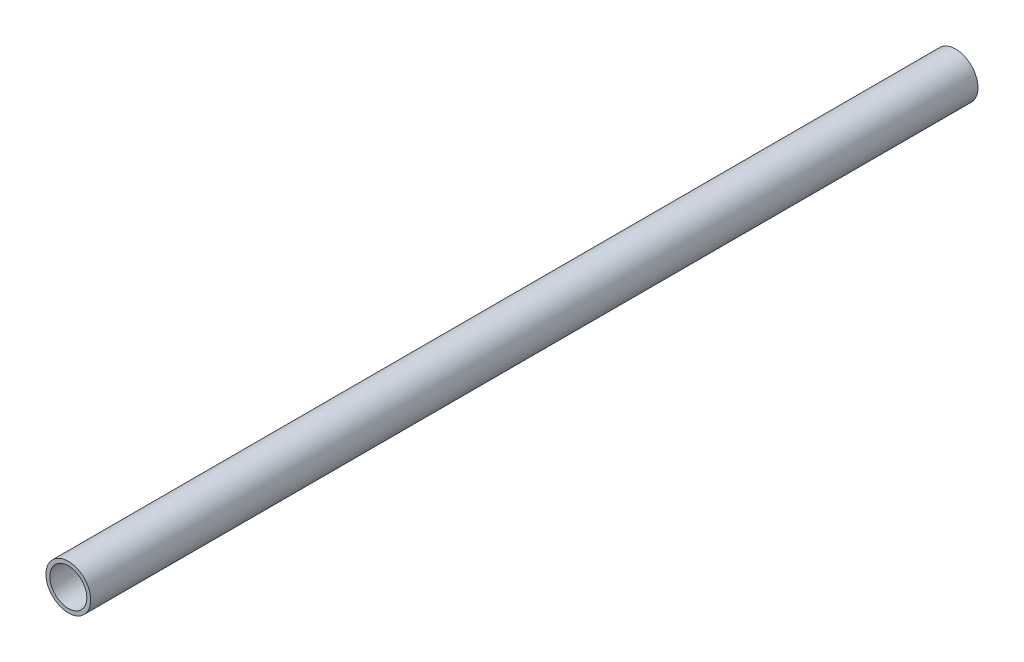
ISO-10303-21;
HEADER;
FILE_DESCRIPTION(('STEP AP214'),'2;1');
FILE_NAME('part.step','',(''),(''),'','','');
FILE_SCHEMA(('AUTOMOTIVE_DESIGN { 1 0 10303 214 1 1 1 1 }'));
ENDSEC;
DATA;
#1=APPLICATION_CONTEXT('core data for automotive mechanical design processes');
#2=APPLICATION_PROTOCOL_DEFINITION('international standard','automotive_design',2000,#1);
#3=PRODUCT_CONTEXT('',#1,'mechanical');
#4=PRODUCT('Part','Part','',(#3));
#5=PRODUCT_RELATED_PRODUCT_CATEGORY('part','',(#4));
#6=PRODUCT_DEFINITION_FORMATION('','',#4);
#7=PRODUCT_DEFINITION_CONTEXT('part definition',#1,'design');
#8=PRODUCT_DEFINITION('design','',#6,#7);
#9=PRODUCT_DEFINITION_SHAPE('','',#8);
#10=(LENGTH_UNIT() NAMED_UNIT(*) SI_UNIT(.MILLI.,.METRE.));
#11=(NAMED_UNIT(*) PLANE_ANGLE_UNIT() SI_UNIT($,.RADIAN.));
#12=(NAMED_UNIT(*) SI_UNIT($,.STERADIAN.) SOLID_ANGLE_UNIT());
#13=UNCERTAINTY_MEASURE_WITH_UNIT(LENGTH_MEASURE(1.E-05),#10,'distance_accuracy_value','');
#14=(GEOMETRIC_REPRESENTATION_CONTEXT(3) GLOBAL_UNCERTAINTY_ASSIGNED_CONTEXT((#13)) GLOBAL_UNIT_ASSIGNED_CONTEXT((#10,
#11,#12)) REPRESENTATION_CONTEXT('',''));
#15=CARTESIAN_POINT('',(0.,0.,0.));
#16=DIRECTION('',(0.,0.,1.));
#17=DIRECTION('',(1.,0.,0.));
#18=AXIS2_PLACEMENT_3D('',#15,#16,#17);
#19=CARTESIAN_POINT('',(0.,0.,188.9125));
#20=DIRECTION('',(0.,0.,1.));
#21=DIRECTION('',(1.,0.,0.));
#22=AXIS2_PLACEMENT_3D('',#19,#20,#21);
#23=PLANE('',#22);
#24=CARTESIAN_POINT('',(0.,0.,188.9125));
#25=DIRECTION('',(0.,0.,1.));
#26=DIRECTION('',(1.,0.,0.));
#27=AXIS2_PLACEMENT_3D('',#24,#25,#26);
#28=CIRCLE('',#27,9.525);
#29=CARTESIAN_POINT('',(9.525,0.,188.9125));
#30=VERTEX_POINT('',#29);
#31=EDGE_CURVE('E10',#30,#30,#28,.T.);
#32=ORIENTED_EDGE('',*,*,#31,.T.);
#33=EDGE_LOOP('',(#32));
#34=FACE_BOUND('',#33,.T.);
#35=CARTESIAN_POINT('',(0.,0.,188.9125));
#36=DIRECTION('',(0.,0.,1.));
#37=DIRECTION('',(1.,0.,0.));
#38=AXIS2_PLACEMENT_3D('',#35,#36,#37);
#39=CIRCLE('',#38,7.874);
#40=CARTESIAN_POINT('',(7.874,0.,188.9125));
#41=VERTEX_POINT('',#40);
#42=EDGE_CURVE('E46',#41,#41,#39,.T.);
#43=ORIENTED_EDGE('',*,*,#42,.F.);
#44=EDGE_LOOP('',(#43));
#45=FACE_BOUND('',#44,.T.);
#46=ADVANCED_FACE('F35',(#34,#45),#23,.T.);
#47=CARTESIAN_POINT('',(0.,0.,-188.9125));
#48=DIRECTION('',(0.,0.,1.));
#49=DIRECTION('',(1.,0.,0.));
#50=AXIS2_PLACEMENT_3D('',#47,#48,#49);
#51=PLANE('',#50);
#52=CARTESIAN_POINT('',(0.,0.,-188.9125));
#53=DIRECTION('',(0.,0.,1.));
#54=DIRECTION('',(1.,0.,0.));
#55=AXIS2_PLACEMENT_3D('',#52,#53,#54);
#56=CIRCLE('',#55,9.525);
#57=CARTESIAN_POINT('',(9.525,0.,-188.9125));
#58=VERTEX_POINT('',#57);
#59=EDGE_CURVE('E39',#58,#58,#56,.T.);
#60=ORIENTED_EDGE('',*,*,#59,.F.);
#61=EDGE_LOOP('',(#60));
#62=FACE_BOUND('',#61,.T.);
#63=CARTESIAN_POINT('',(0.,0.,-188.9125));
#64=DIRECTION('',(0.,0.,1.));
#65=DIRECTION('',(1.,0.,0.));
#66=AXIS2_PLACEMENT_3D('',#63,#64,#65);
#67=CIRCLE('',#66,7.874);
#68=CARTESIAN_POINT('',(7.874,0.,-188.9125));
#69=VERTEX_POINT('',#68);
#70=EDGE_CURVE('E48',#69,#69,#67,.T.);
#71=ORIENTED_EDGE('',*,*,#70,.T.);
#72=EDGE_LOOP('',(#71));
#73=FACE_BOUND('',#72,.T.);
#74=ADVANCED_FACE('F58',(#62,#73),#51,.F.);
#75=CARTESIAN_POINT('',(0.,0.,188.9125));
#76=DIRECTION('',(0.,0.,-1.));
#77=DIRECTION('',(-1.,0.,0.));
#78=AXIS2_PLACEMENT_3D('',#75,#76,#77);
#79=CYLINDRICAL_SURFACE('',#78,9.525);
#80=ORIENTED_EDGE('',*,*,#31,.F.);
#81=EDGE_LOOP('',(#80));
#82=FACE_BOUND('',#81,.T.);
#83=ORIENTED_EDGE('',*,*,#59,.T.);
#84=EDGE_LOOP('',(#83));
#85=FACE_BOUND('',#84,.T.);
#86=ADVANCED_FACE('F37',(#82,#85),#79,.T.);
#87=CARTESIAN_POINT('',(0.,0.,188.9125));
#88=DIRECTION('',(0.,0.,-1.));
#89=DIRECTION('',(-1.,0.,0.));
#90=AXIS2_PLACEMENT_3D('',#87,#88,#89);
#91=CYLINDRICAL_SURFACE('',#90,7.874);
#92=ORIENTED_EDGE('',*,*,#42,.T.);
#93=EDGE_LOOP('',(#92));
#94=FACE_BOUND('',#93,.T.);
#95=ORIENTED_EDGE('',*,*,#70,.F.);
#96=EDGE_LOOP('',(#95));
#97=FACE_BOUND('',#96,.T.);
#98=ADVANCED_FACE('F54',(#94,#97),#91,.F.);
#99=CLOSED_SHELL('',(#46,#74,#86,#98));
#100=MANIFOLD_SOLID_BREP('B2',#99);
#101=ADVANCED_BREP_SHAPE_REPRESENTATION('',(#18,#100),#14);
#102=SHAPE_DEFINITION_REPRESENTATION(#9,#101);
ENDSEC;
END-ISO-10303-21;
